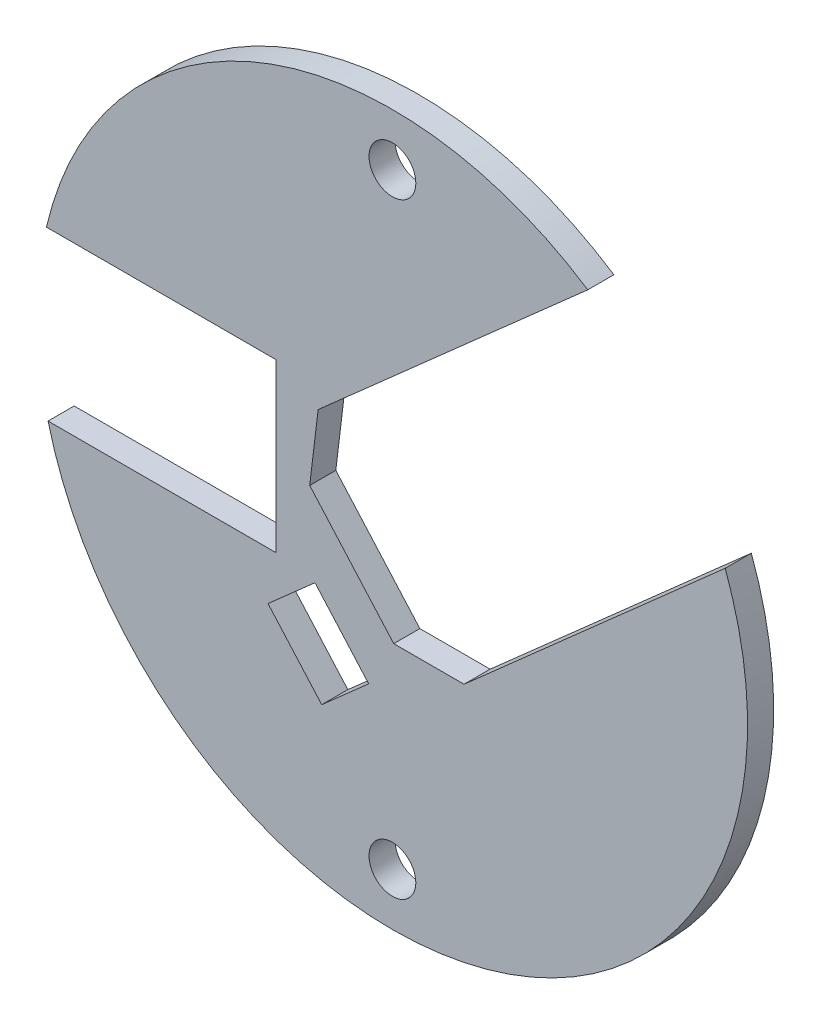
ISO-10303-21;
HEADER;
FILE_DESCRIPTION(('STEP AP214'),'2;1');
FILE_NAME('part.step','',(''),(''),'','','');
FILE_SCHEMA(('AUTOMOTIVE_DESIGN { 1 0 10303 214 1 1 1 1 }'));
ENDSEC;
DATA;
#1=APPLICATION_CONTEXT('core data for automotive mechanical design processes');
#2=APPLICATION_PROTOCOL_DEFINITION('international standard','automotive_design',2000,#1);
#3=PRODUCT_CONTEXT('',#1,'mechanical');
#4=PRODUCT('Part','Part','',(#3));
#5=PRODUCT_RELATED_PRODUCT_CATEGORY('part','',(#4));
#6=PRODUCT_DEFINITION_FORMATION('','',#4);
#7=PRODUCT_DEFINITION_CONTEXT('part definition',#1,'design');
#8=PRODUCT_DEFINITION('design','',#6,#7);
#9=PRODUCT_DEFINITION_SHAPE('','',#8);
#10=(LENGTH_UNIT() NAMED_UNIT(*) SI_UNIT(.MILLI.,.METRE.));
#11=(NAMED_UNIT(*) PLANE_ANGLE_UNIT() SI_UNIT($,.RADIAN.));
#12=(NAMED_UNIT(*) SI_UNIT($,.STERADIAN.) SOLID_ANGLE_UNIT());
#13=UNCERTAINTY_MEASURE_WITH_UNIT(LENGTH_MEASURE(1.E-05),#10,'distance_accuracy_value','');
#14=(GEOMETRIC_REPRESENTATION_CONTEXT(3) GLOBAL_UNCERTAINTY_ASSIGNED_CONTEXT((#13)) GLOBAL_UNIT_ASSIGNED_CONTEXT((#10,
#11,#12)) REPRESENTATION_CONTEXT('',''));
#15=CARTESIAN_POINT('',(0.,0.,0.));
#16=DIRECTION('',(0.,0.,1.));
#17=DIRECTION('',(1.,0.,0.));
#18=AXIS2_PLACEMENT_3D('',#15,#16,#17);
#19=CARTESIAN_POINT('',(-3.73426164317338,4.22147900554515,1.5875));
#20=DIRECTION('',(-0.66256157635468,0.749007448252954,0.));
#21=DIRECTION('',(-0.749007448252954,-0.66256157635468,0.));
#22=AXIS2_PLACEMENT_3D('',#19,#20,#21);
#23=PLANE('',#22);
#24=DIRECTION('',(0.749007448252954,0.66256157635468,0.));
#25=VECTOR('',#24,1.);
#26=CARTESIAN_POINT('',(-3.73426164317338,4.22147900554515,0.));
#27=LINE('',#26,#25);
#28=CARTESIAN_POINT('',(-4.51528115813224,3.5306,0.));
#29=VERTEX_POINT('',#28);
#30=CARTESIAN_POINT('',(11.8760761518911,18.0301668110554,0.));
#31=VERTEX_POINT('',#30);
#32=EDGE_CURVE('E189',#29,#31,#27,.T.);
#33=ORIENTED_EDGE('',*,*,#32,.T.);
#34=DIRECTION('',(0.,0.,-1.));
#35=VECTOR('',#34,1.);
#36=CARTESIAN_POINT('',(11.8760761518911,18.0301668110554,1.5875));
#37=LINE('',#36,#35);
#38=CARTESIAN_POINT('',(11.8760761518911,18.0301668110554,1.5875));
#39=VERTEX_POINT('',#38);
#40=EDGE_CURVE('E11',#39,#31,#37,.T.);
#41=ORIENTED_EDGE('',*,*,#40,.F.);
#42=DIRECTION('',(0.749007448252954,0.66256157635468,0.));
#43=VECTOR('',#42,1.);
#44=CARTESIAN_POINT('',(-3.73426164317338,4.22147900554515,1.5875));
#45=LINE('',#44,#43);
#46=CARTESIAN_POINT('',(-4.51528115813224,3.5306,1.5875));
#47=VERTEX_POINT('',#46);
#48=EDGE_CURVE('E263',#47,#39,#45,.T.);
#49=ORIENTED_EDGE('',*,*,#48,.F.);
#50=DIRECTION('',(0.,0.,-1.));
#51=VECTOR('',#50,1.);
#52=CARTESIAN_POINT('',(-4.51528115813224,3.5306,1.5875));
#53=LINE('',#52,#51);
#54=EDGE_CURVE('E53',#47,#29,#53,.T.);
#55=ORIENTED_EDGE('',*,*,#54,.T.);
#56=EDGE_LOOP('',(#33,#41,#49,#55));
#57=FACE_BOUND('',#56,.T.);
#58=ADVANCED_FACE('F34',(#57),#23,.F.);
#59=CARTESIAN_POINT('',(0.,0.,1.5875));
#60=DIRECTION('',(0.,0.,-1.));
#61=DIRECTION('',(-1.,0.,0.));
#62=AXIS2_PLACEMENT_3D('',#59,#60,#61);
#63=CYLINDRICAL_SURFACE('',#62,21.59);
#64=CARTESIAN_POINT('',(0.,0.,0.));
#65=DIRECTION('',(0.,0.,1.));
#66=DIRECTION('',(1.,0.,0.));
#67=AXIS2_PLACEMENT_3D('',#64,#65,#66);
#68=CIRCLE('',#67,21.59);
#69=CARTESIAN_POINT('',(-21.0319975694179,4.8768,0.));
#70=VERTEX_POINT('',#69);
#71=EDGE_CURVE('E191',#31,#70,#68,.T.);
#72=ORIENTED_EDGE('',*,*,#71,.T.);
#73=DIRECTION('',(0.,0.,-1.));
#74=VECTOR('',#73,1.);
#75=CARTESIAN_POINT('',(-21.0319975694179,4.8768,1.5875));
#76=LINE('',#75,#74);
#77=CARTESIAN_POINT('',(-21.0319975694179,4.8768,1.5875));
#78=VERTEX_POINT('',#77);
#79=EDGE_CURVE('E44',#78,#70,#76,.T.);
#80=ORIENTED_EDGE('',*,*,#79,.F.);
#81=CARTESIAN_POINT('',(0.,0.,1.5875));
#82=DIRECTION('',(0.,0.,1.));
#83=DIRECTION('',(1.,0.,0.));
#84=AXIS2_PLACEMENT_3D('',#81,#82,#83);
#85=CIRCLE('',#84,21.59);
#86=EDGE_CURVE('E265',#39,#78,#85,.T.);
#87=ORIENTED_EDGE('',*,*,#86,.F.);
#88=ORIENTED_EDGE('',*,*,#40,.T.);
#89=EDGE_LOOP('',(#72,#80,#87,#88));
#90=FACE_BOUND('',#89,.T.);
#91=ADVANCED_FACE('F299',(#90),#63,.T.);
#92=CARTESIAN_POINT('',(0.,4.8768,1.5875));
#93=DIRECTION('',(0.,1.,0.));
#94=DIRECTION('',(-1.,0.,0.));
#95=AXIS2_PLACEMENT_3D('',#92,#93,#94);
#96=PLANE('',#95);
#97=DIRECTION('',(1.,0.,0.));
#98=VECTOR('',#97,1.);
#99=CARTESIAN_POINT('',(0.,4.8768,0.));
#100=LINE('',#99,#98);
#101=CARTESIAN_POINT('',(-7.08496533764944,4.8768,0.));
#102=VERTEX_POINT('',#101);
#103=EDGE_CURVE('E193',#70,#102,#100,.T.);
#104=ORIENTED_EDGE('',*,*,#103,.T.);
#105=DIRECTION('',(0.,0.,-1.));
#106=VECTOR('',#105,1.);
#107=CARTESIAN_POINT('',(-7.08496533764944,4.8768,1.5875));
#108=LINE('',#107,#106);
#109=CARTESIAN_POINT('',(-7.08496533764944,4.8768,1.5875));
#110=VERTEX_POINT('',#109);
#111=EDGE_CURVE('E221',#110,#102,#108,.T.);
#112=ORIENTED_EDGE('',*,*,#111,.F.);
#113=DIRECTION('',(1.,0.,0.));
#114=VECTOR('',#113,1.);
#115=CARTESIAN_POINT('',(0.,4.8768,1.5875));
#116=LINE('',#115,#114);
#117=EDGE_CURVE('E267',#78,#110,#116,.T.);
#118=ORIENTED_EDGE('',*,*,#117,.F.);
#119=ORIENTED_EDGE('',*,*,#79,.T.);
#120=EDGE_LOOP('',(#104,#112,#118,#119));
#121=FACE_BOUND('',#120,.T.);
#122=ADVANCED_FACE('F304',(#121),#96,.F.);
#123=CARTESIAN_POINT('',(-7.08496533764945,0.,1.5875));
#124=DIRECTION('',(1.,0.,0.));
#125=DIRECTION('',(0.,1.,0.));
#126=AXIS2_PLACEMENT_3D('',#123,#124,#125);
#127=PLANE('',#126);
#128=DIRECTION('',(0.,-1.,0.));
#129=VECTOR('',#128,1.);
#130=CARTESIAN_POINT('',(-7.08496533764945,0.,0.));
#131=LINE('',#130,#129);
#132=CARTESIAN_POINT('',(-7.08496533764946,-5.2832,0.));
#133=VERTEX_POINT('',#132);
#134=EDGE_CURVE('E196',#102,#133,#131,.T.);
#135=ORIENTED_EDGE('',*,*,#134,.T.);
#136=DIRECTION('',(0.,0.,-1.));
#137=VECTOR('',#136,1.);
#138=CARTESIAN_POINT('',(-7.08496533764946,-5.2832,1.5875));
#139=LINE('',#138,#137);
#140=CARTESIAN_POINT('',(-7.08496533764946,-5.2832,1.5875));
#141=VERTEX_POINT('',#140);
#142=EDGE_CURVE('E218',#141,#133,#139,.T.);
#143=ORIENTED_EDGE('',*,*,#142,.F.);
#144=DIRECTION('',(0.,-1.,0.));
#145=VECTOR('',#144,1.);
#146=CARTESIAN_POINT('',(-7.08496533764945,0.,1.5875));
#147=LINE('',#146,#145);
#148=EDGE_CURVE('E270',#110,#141,#147,.T.);
#149=ORIENTED_EDGE('',*,*,#148,.F.);
#150=ORIENTED_EDGE('',*,*,#111,.T.);
#151=EDGE_LOOP('',(#135,#143,#149,#150));
#152=FACE_BOUND('',#151,.T.);
#153=ADVANCED_FACE('F335',(#152),#127,.F.);
#154=CARTESIAN_POINT('',(0.,-5.2832,1.5875));
#155=DIRECTION('',(0.,-1.,0.));
#156=DIRECTION('',(1.,0.,0.));
#157=AXIS2_PLACEMENT_3D('',#154,#155,#156);
#158=PLANE('',#157);
#159=DIRECTION('',(-1.,0.,0.));
#160=VECTOR('',#159,1.);
#161=CARTESIAN_POINT('',(0.,-5.2832,0.));
#162=LINE('',#161,#160);
#163=CARTESIAN_POINT('',(-20.9336068980002,-5.2832,0.));
#164=VERTEX_POINT('',#163);
#165=EDGE_CURVE('E198',#133,#164,#162,.T.);
#166=ORIENTED_EDGE('',*,*,#165,.T.);
#167=DIRECTION('',(0.,0.,-1.));
#168=VECTOR('',#167,1.);
#169=CARTESIAN_POINT('',(-20.9336068980002,-5.2832,1.5875));
#170=LINE('',#169,#168);
#171=CARTESIAN_POINT('',(-20.9336068980002,-5.2832,1.5875));
#172=VERTEX_POINT('',#171);
#173=EDGE_CURVE('E215',#172,#164,#170,.T.);
#174=ORIENTED_EDGE('',*,*,#173,.F.);
#175=DIRECTION('',(-1.,0.,0.));
#176=VECTOR('',#175,1.);
#177=CARTESIAN_POINT('',(0.,-5.2832,1.5875));
#178=LINE('',#177,#176);
#179=EDGE_CURVE('E272',#141,#172,#178,.T.);
#180=ORIENTED_EDGE('',*,*,#179,.F.);
#181=ORIENTED_EDGE('',*,*,#142,.T.);
#182=EDGE_LOOP('',(#166,#174,#180,#181));
#183=FACE_BOUND('',#182,.T.);
#184=ADVANCED_FACE('F333',(#183),#158,.F.);
#185=CARTESIAN_POINT('',(20.2280419112054,7.54681525138367,0.));
#186=VERTEX_POINT('',#185);
#187=EDGE_CURVE('E194',#164,#186,#68,.T.);
#188=ORIENTED_EDGE('',*,*,#187,.T.);
#189=DIRECTION('',(0.,0.,-1.));
#190=VECTOR('',#189,1.);
#191=CARTESIAN_POINT('',(20.2280419112054,7.54681525138367,1.5875));
#192=LINE('',#191,#190);
#193=CARTESIAN_POINT('',(20.2280419112054,7.54681525138367,1.5875));
#194=VERTEX_POINT('',#193);
#195=EDGE_CURVE('E213',#194,#186,#192,.T.);
#196=ORIENTED_EDGE('',*,*,#195,.F.);
#197=EDGE_CURVE('E268',#172,#194,#85,.T.);
#198=ORIENTED_EDGE('',*,*,#197,.F.);
#199=ORIENTED_EDGE('',*,*,#173,.T.);
#200=EDGE_LOOP('',(#188,#196,#198,#199));
#201=FACE_BOUND('',#200,.T.);
#202=ADVANCED_FACE('F280',(#201),#63,.T.);
#203=CARTESIAN_POINT('',(5.13465510559509,-5.80458489527924,1.5875));
#204=DIRECTION('',(-0.66256157635468,0.749007448252954,0.));
#205=DIRECTION('',(-0.749007448252954,-0.66256157635468,0.));
#206=AXIS2_PLACEMENT_3D('',#203,#204,#205);
#207=PLANE('',#206);
#208=DIRECTION('',(0.749007448252954,0.66256157635468,0.));
#209=VECTOR('',#208,1.);
#210=CARTESIAN_POINT('',(5.13465510559509,-5.80458489527924,0.));
#211=LINE('',#210,#209);
#212=CARTESIAN_POINT('',(4.35363559063623,-6.49546390082439,0.));
#213=VERTEX_POINT('',#212);
#214=EDGE_CURVE('E200',#213,#186,#211,.T.);
#215=ORIENTED_EDGE('',*,*,#214,.F.);
#216=DIRECTION('',(0.,0.,-1.));
#217=VECTOR('',#216,1.);
#218=CARTESIAN_POINT('',(4.35363559063623,-6.49546390082439,1.5875));
#219=LINE('',#218,#217);
#220=CARTESIAN_POINT('',(4.35363559063623,-6.49546390082439,1.5875));
#221=VERTEX_POINT('',#220);
#222=EDGE_CURVE('E163',#221,#213,#219,.T.);
#223=ORIENTED_EDGE('',*,*,#222,.F.);
#224=DIRECTION('',(0.749007448252954,0.66256157635468,0.));
#225=VECTOR('',#224,1.);
#226=CARTESIAN_POINT('',(5.13465510559509,-5.80458489527924,1.5875));
#227=LINE('',#226,#225);
#228=EDGE_CURVE('E153',#221,#194,#227,.T.);
#229=ORIENTED_EDGE('',*,*,#228,.T.);
#230=ORIENTED_EDGE('',*,*,#195,.T.);
#231=EDGE_LOOP('',(#215,#223,#229,#230));
#232=FACE_BOUND('',#231,.T.);
#233=ADVANCED_FACE('F283',(#232),#207,.T.);
#234=CARTESIAN_POINT('',(0.,-6.49546390082439,1.5875));
#235=DIRECTION('',(0.,-1.,0.));
#236=DIRECTION('',(0.,0.,-1.));
#237=AXIS2_PLACEMENT_3D('',#234,#235,#236);
#238=PLANE('',#237);
#239=DIRECTION('',(-1.,0.,0.));
#240=VECTOR('',#239,1.);
#241=CARTESIAN_POINT('',(0.,-6.49546390082439,0.));
#242=LINE('',#241,#240);
#243=CARTESIAN_POINT('',(0.0807525172120513,-6.49546390082439,0.));
#244=VERTEX_POINT('',#243);
#245=EDGE_CURVE('E160',#213,#244,#242,.T.);
#246=ORIENTED_EDGE('',*,*,#245,.T.);
#247=DIRECTION('',(0.,0.,-1.));
#248=VECTOR('',#247,1.);
#249=CARTESIAN_POINT('',(0.0807525172120513,-6.49546390082439,1.5875));
#250=LINE('',#249,#248);
#251=CARTESIAN_POINT('',(0.0807525172120513,-6.49546390082439,1.5875));
#252=VERTEX_POINT('',#251);
#253=EDGE_CURVE('E157',#252,#244,#250,.T.);
#254=ORIENTED_EDGE('',*,*,#253,.F.);
#255=DIRECTION('',(-1.,0.,0.));
#256=VECTOR('',#255,1.);
#257=CARTESIAN_POINT('',(0.,-6.49546390082439,1.5875));
#258=LINE('',#257,#256);
#259=EDGE_CURVE('E145',#221,#252,#258,.T.);
#260=ORIENTED_EDGE('',*,*,#259,.F.);
#261=ORIENTED_EDGE('',*,*,#222,.T.);
#262=EDGE_LOOP('',(#246,#254,#260,#261));
#263=FACE_BOUND('',#262,.T.);
#264=ADVANCED_FACE('F158',(#263),#238,.F.);
#265=CARTESIAN_POINT('',(-3.17815886688987,-2.81135515229351,1.5875));
#266=DIRECTION('',(0.749007448252954,0.66256157635468,0.));
#267=DIRECTION('',(-0.66256157635468,0.749007448252954,0.));
#268=AXIS2_PLACEMENT_3D('',#265,#266,#267);
#269=PLANE('',#268);
#270=DIRECTION('',(0.66256157635468,-0.749007448252954,0.));
#271=VECTOR('',#270,1.);
#272=CARTESIAN_POINT('',(-3.17815886688987,-2.81135515229351,0.));
#273=LINE('',#272,#271);
#274=CARTESIAN_POINT('',(-5.02756533764946,-0.720652535538369,0.));
#275=VERTEX_POINT('',#274);
#276=EDGE_CURVE('E204',#275,#244,#273,.T.);
#277=ORIENTED_EDGE('',*,*,#276,.F.);
#278=DIRECTION('',(0.,0.,-1.));
#279=VECTOR('',#278,1.);
#280=CARTESIAN_POINT('',(-5.02756533764946,-0.720652535538369,1.5875));
#281=LINE('',#280,#279);
#282=CARTESIAN_POINT('',(-5.02756533764946,-0.720652535538369,1.5875));
#283=VERTEX_POINT('',#282);
#284=EDGE_CURVE('E97',#283,#275,#281,.T.);
#285=ORIENTED_EDGE('',*,*,#284,.F.);
#286=DIRECTION('',(0.66256157635468,-0.749007448252954,0.));
#287=VECTOR('',#286,1.);
#288=CARTESIAN_POINT('',(-3.17815886688987,-2.81135515229351,1.5875));
#289=LINE('',#288,#287);
#290=EDGE_CURVE('E151',#283,#252,#289,.T.);
#291=ORIENTED_EDGE('',*,*,#290,.T.);
#292=ORIENTED_EDGE('',*,*,#253,.T.);
#293=EDGE_LOOP('',(#277,#285,#291,#292));
#294=FACE_BOUND('',#293,.T.);
#295=ADVANCED_FACE('F165',(#294),#269,.T.);
#296=CARTESIAN_POINT('',(-5.46113356916488,-4.83084283702258,1.5875));
#297=DIRECTION('',(0.749007448252954,0.66256157635468,0.));
#298=DIRECTION('',(-0.66256157635468,0.749007448252954,0.));
#299=AXIS2_PLACEMENT_3D('',#296,#297,#298);
#300=PLANE('',#299);
#301=DIRECTION('',(0.66256157635468,-0.749007448252954,0.));
#302=VECTOR('',#301,1.);
#303=CARTESIAN_POINT('',(-5.46113356916488,-4.83084283702258,0.));
#304=LINE('',#303,#302);
#305=CARTESIAN_POINT('',(-4.70834541938866,-5.68184891896463,0.));
#306=VERTEX_POINT('',#305);
#307=CARTESIAN_POINT('',(-1.44350699574333,-9.37265802097589,0.));
#308=VERTEX_POINT('',#307);
#309=EDGE_CURVE('E172',#306,#308,#304,.T.);
#310=ORIENTED_EDGE('',*,*,#309,.T.);
#311=DIRECTION('',(0.,0.,-1.));
#312=VECTOR('',#311,1.);
#313=CARTESIAN_POINT('',(-1.44350699574333,-9.37265802097589,1.5875));
#314=LINE('',#313,#312);
#315=CARTESIAN_POINT('',(-1.44350699574333,-9.37265802097589,1.5875));
#316=VERTEX_POINT('',#315);
#317=EDGE_CURVE('E38',#316,#308,#314,.T.);
#318=ORIENTED_EDGE('',*,*,#317,.F.);
#319=DIRECTION('',(0.66256157635468,-0.749007448252954,0.));
#320=VECTOR('',#319,1.);
#321=CARTESIAN_POINT('',(-5.46113356916488,-4.83084283702258,1.5875));
#322=LINE('',#321,#320);
#323=CARTESIAN_POINT('',(-4.70834541938866,-5.68184891896463,1.5875));
#324=VERTEX_POINT('',#323);
#325=EDGE_CURVE('E209',#324,#316,#322,.T.);
#326=ORIENTED_EDGE('',*,*,#325,.F.);
#327=DIRECTION('',(0.,0.,-1.));
#328=VECTOR('',#327,1.);
#329=CARTESIAN_POINT('',(-4.70834541938866,-5.68184891896463,1.5875));
#330=LINE('',#329,#328);
#331=EDGE_CURVE('E168',#324,#306,#330,.T.);
#332=ORIENTED_EDGE('',*,*,#331,.T.);
#333=EDGE_LOOP('',(#310,#318,#326,#332));
#334=FACE_BOUND('',#333,.T.);
#335=ADVANCED_FACE('F36',(#334),#300,.F.);
#336=CARTESIAN_POINT('',(4.01762657342154,-4.54181518395331,1.5875));
#337=DIRECTION('',(0.66256157635468,-0.749007448252954,0.));
#338=DIRECTION('',(0.749007448252954,0.66256157635468,0.));
#339=AXIS2_PLACEMENT_3D('',#336,#337,#338);
#340=PLANE('',#339);
#341=DIRECTION('',(-0.749007448252954,-0.66256157635468,0.));
#342=VECTOR('',#341,1.);
#343=CARTESIAN_POINT('',(4.01762657342154,-4.54181518395331,0.));
#344=LINE('',#343,#342);
#345=CARTESIAN_POINT('',(-4.29722537358709,-11.8970176268872,0.));
#346=VERTEX_POINT('',#345);
#347=EDGE_CURVE('E175',#308,#346,#344,.T.);
#348=ORIENTED_EDGE('',*,*,#347,.T.);
#349=DIRECTION('',(0.,0.,-1.));
#350=VECTOR('',#349,1.);
#351=CARTESIAN_POINT('',(-4.29722537358709,-11.8970176268872,1.5875));
#352=LINE('',#351,#350);
#353=CARTESIAN_POINT('',(-4.29722537358709,-11.8970176268872,1.5875));
#354=VERTEX_POINT('',#353);
#355=EDGE_CURVE('E229',#354,#346,#352,.T.);
#356=ORIENTED_EDGE('',*,*,#355,.F.);
#357=DIRECTION('',(-0.749007448252954,-0.66256157635468,0.));
#358=VECTOR('',#357,1.);
#359=CARTESIAN_POINT('',(4.01762657342154,-4.54181518395331,1.5875));
#360=LINE('',#359,#358);
#361=EDGE_CURVE('E110',#316,#354,#360,.T.);
#362=ORIENTED_EDGE('',*,*,#361,.F.);
#363=ORIENTED_EDGE('',*,*,#317,.T.);
#364=EDGE_LOOP('',(#348,#356,#362,#363));
#365=FACE_BOUND('',#364,.T.);
#366=ADVANCED_FACE('F234',(#365),#340,.F.);
#367=CARTESIAN_POINT('',(-8.31485194700863,-7.35520244293391,1.5875));
#368=DIRECTION('',(0.749007448252954,0.66256157635468,0.));
#369=DIRECTION('',(-0.66256157635468,0.749007448252954,0.));
#370=AXIS2_PLACEMENT_3D('',#367,#368,#369);
#371=PLANE('',#370);
#372=DIRECTION('',(0.66256157635468,-0.749007448252954,0.));
#373=VECTOR('',#372,1.);
#374=CARTESIAN_POINT('',(-8.31485194700863,-7.35520244293391,0.));
#375=LINE('',#374,#373);
#376=CARTESIAN_POINT('',(-7.56206379723241,-8.20620852487597,0.));
#377=VERTEX_POINT('',#376);
#378=EDGE_CURVE('E178',#377,#346,#375,.T.);
#379=ORIENTED_EDGE('',*,*,#378,.F.);
#380=DIRECTION('',(0.,0.,-1.));
#381=VECTOR('',#380,1.);
#382=CARTESIAN_POINT('',(-7.56206379723241,-8.20620852487597,1.5875));
#383=LINE('',#382,#381);
#384=CARTESIAN_POINT('',(-7.56206379723241,-8.20620852487597,1.5875));
#385=VERTEX_POINT('',#384);
#386=EDGE_CURVE('E228',#385,#377,#383,.T.);
#387=ORIENTED_EDGE('',*,*,#386,.F.);
#388=DIRECTION('',(0.66256157635468,-0.749007448252954,0.));
#389=VECTOR('',#388,1.);
#390=CARTESIAN_POINT('',(-8.31485194700863,-7.35520244293391,1.5875));
#391=LINE('',#390,#389);
#392=EDGE_CURVE('E246',#385,#354,#391,.T.);
#393=ORIENTED_EDGE('',*,*,#392,.T.);
#394=ORIENTED_EDGE('',*,*,#355,.T.);
#395=EDGE_LOOP('',(#379,#387,#393,#394));
#396=FACE_BOUND('',#395,.T.);
#397=ADVANCED_FACE('F243',(#396),#371,.T.);
#398=CARTESIAN_POINT('',(0.,-18.415,1.5875));
#399=DIRECTION('',(0.,0.,-1.));
#400=DIRECTION('',(-1.,0.,0.));
#401=AXIS2_PLACEMENT_3D('',#398,#399,#400);
#402=CYLINDRICAL_SURFACE('',#401,1.4224);
#403=CARTESIAN_POINT('',(0.,-18.415,1.5875));
#404=DIRECTION('',(0.,0.,1.));
#405=DIRECTION('',(1.,0.,0.));
#406=AXIS2_PLACEMENT_3D('',#403,#404,#405);
#407=CIRCLE('',#406,1.4224);
#408=CARTESIAN_POINT('',(1.4224,-18.415,1.5875));
#409=VERTEX_POINT('',#408);
#410=EDGE_CURVE('E260',#409,#409,#407,.T.);
#411=ORIENTED_EDGE('',*,*,#410,.T.);
#412=EDGE_LOOP('',(#411));
#413=FACE_BOUND('',#412,.T.);
#414=CARTESIAN_POINT('',(0.,-18.415,0.));
#415=DIRECTION('',(0.,0.,1.));
#416=DIRECTION('',(1.,0.,0.));
#417=AXIS2_PLACEMENT_3D('',#414,#415,#416);
#418=CIRCLE('',#417,1.4224);
#419=CARTESIAN_POINT('',(1.4224,-18.415,0.));
#420=VERTEX_POINT('',#419);
#421=EDGE_CURVE('E186',#420,#420,#418,.T.);
#422=ORIENTED_EDGE('',*,*,#421,.F.);
#423=EDGE_LOOP('',(#422));
#424=FACE_BOUND('',#423,.T.);
#425=ADVANCED_FACE('F310',(#413,#424),#402,.F.);
#426=CARTESIAN_POINT('',(0.,18.415,1.5875));
#427=DIRECTION('',(0.,0.,-1.));
#428=DIRECTION('',(-1.,0.,0.));
#429=AXIS2_PLACEMENT_3D('',#426,#427,#428);
#430=CYLINDRICAL_SURFACE('',#429,1.4224);
#431=CARTESIAN_POINT('',(0.,18.415,1.5875));
#432=DIRECTION('',(0.,0.,1.));
#433=DIRECTION('',(1.,0.,0.));
#434=AXIS2_PLACEMENT_3D('',#431,#432,#433);
#435=CIRCLE('',#434,1.4224);
#436=CARTESIAN_POINT('',(1.4224,18.415,1.5875));
#437=VERTEX_POINT('',#436);
#438=EDGE_CURVE('E251',#437,#437,#435,.T.);
#439=ORIENTED_EDGE('',*,*,#438,.T.);
#440=EDGE_LOOP('',(#439));
#441=FACE_BOUND('',#440,.T.);
#442=CARTESIAN_POINT('',(0.,18.415,0.));
#443=DIRECTION('',(0.,0.,1.));
#444=DIRECTION('',(1.,0.,0.));
#445=AXIS2_PLACEMENT_3D('',#442,#443,#444);
#446=CIRCLE('',#445,1.4224);
#447=CARTESIAN_POINT('',(1.4224,18.415,0.));
#448=VERTEX_POINT('',#447);
#449=EDGE_CURVE('E183',#448,#448,#446,.T.);
#450=ORIENTED_EDGE('',*,*,#449,.F.);
#451=EDGE_LOOP('',(#450));
#452=FACE_BOUND('',#451,.T.);
#453=ADVANCED_FACE('F294',(#441,#452),#430,.F.);
#454=CARTESIAN_POINT('',(0.752788149776217,-0.851006081942052,1.5875));
#455=DIRECTION('',(-0.66256157635468,0.749007448252954,0.));
#456=DIRECTION('',(-0.749007448252954,-0.66256157635468,0.));
#457=AXIS2_PLACEMENT_3D('',#454,#455,#456);
#458=PLANE('',#457);
#459=DIRECTION('',(0.749007448252954,0.66256157635468,0.));
#460=VECTOR('',#459,1.);
#461=CARTESIAN_POINT('',(0.752788149776217,-0.851006081942052,0.));
#462=LINE('',#461,#460);
#463=EDGE_CURVE('E181',#377,#306,#462,.T.);
#464=ORIENTED_EDGE('',*,*,#463,.T.);
#465=ORIENTED_EDGE('',*,*,#331,.F.);
#466=DIRECTION('',(0.749007448252954,0.66256157635468,0.));
#467=VECTOR('',#466,1.);
#468=CARTESIAN_POINT('',(0.752788149776217,-0.851006081942052,1.5875));
#469=LINE('',#468,#467);
#470=EDGE_CURVE('E248',#385,#324,#469,.T.);
#471=ORIENTED_EDGE('',*,*,#470,.F.);
#472=ORIENTED_EDGE('',*,*,#386,.T.);
#473=EDGE_LOOP('',(#464,#465,#471,#472));
#474=FACE_BOUND('',#473,.T.);
#475=ADVANCED_FACE('F249',(#474),#458,.F.);
#476=CARTESIAN_POINT('',(-4.87000927917982,0.586845567740416,1.5875));
#477=DIRECTION('',(0.992817765614227,-0.119636467186111,0.));
#478=DIRECTION('',(0.119636467186111,0.992817765614227,0.));
#479=AXIS2_PLACEMENT_3D('',#476,#477,#478);
#480=PLANE('',#479);
#481=DIRECTION('',(-0.119636467186111,-0.992817765614227,0.));
#482=VECTOR('',#481,1.);
#483=CARTESIAN_POINT('',(-4.87000927917982,0.586845567740416,0.));
#484=LINE('',#483,#482);
#485=EDGE_CURVE('E206',#29,#275,#484,.T.);
#486=ORIENTED_EDGE('',*,*,#485,.F.);
#487=ORIENTED_EDGE('',*,*,#54,.F.);
#488=DIRECTION('',(-0.119636467186111,-0.992817765614227,0.));
#489=VECTOR('',#488,1.);
#490=CARTESIAN_POINT('',(-4.87000927917982,0.586845567740416,1.5875));
#491=LINE('',#490,#489);
#492=EDGE_CURVE('E166',#47,#283,#491,.T.);
#493=ORIENTED_EDGE('',*,*,#492,.T.);
#494=ORIENTED_EDGE('',*,*,#284,.T.);
#495=EDGE_LOOP('',(#486,#487,#493,#494));
#496=FACE_BOUND('',#495,.T.);
#497=ADVANCED_FACE('F286',(#496),#480,.T.);
#498=CARTESIAN_POINT('',(0.,0.,1.5875));
#499=DIRECTION('',(0.,0.,1.));
#500=DIRECTION('',(1.,0.,0.));
#501=AXIS2_PLACEMENT_3D('',#498,#499,#500);
#502=PLANE('',#501);
#503=ORIENTED_EDGE('',*,*,#325,.T.);
#504=ORIENTED_EDGE('',*,*,#361,.T.);
#505=ORIENTED_EDGE('',*,*,#392,.F.);
#506=ORIENTED_EDGE('',*,*,#470,.T.);
#507=EDGE_LOOP('',(#503,#504,#505,#506));
#508=FACE_BOUND('',#507,.T.);
#509=ORIENTED_EDGE('',*,*,#438,.F.);
#510=EDGE_LOOP('',(#509));
#511=FACE_BOUND('',#510,.T.);
#512=ORIENTED_EDGE('',*,*,#410,.F.);
#513=EDGE_LOOP('',(#512));
#514=FACE_BOUND('',#513,.T.);
#515=ORIENTED_EDGE('',*,*,#48,.T.);
#516=ORIENTED_EDGE('',*,*,#86,.T.);
#517=ORIENTED_EDGE('',*,*,#117,.T.);
#518=ORIENTED_EDGE('',*,*,#148,.T.);
#519=ORIENTED_EDGE('',*,*,#179,.T.);
#520=ORIENTED_EDGE('',*,*,#197,.T.);
#521=ORIENTED_EDGE('',*,*,#228,.F.);
#522=ORIENTED_EDGE('',*,*,#259,.T.);
#523=ORIENTED_EDGE('',*,*,#290,.F.);
#524=ORIENTED_EDGE('',*,*,#492,.F.);
#525=EDGE_LOOP('',(#515,#516,#517,#518,#519,#520,#521,#522,#523,#524));
#526=FACE_BOUND('',#525,.T.);
#527=ADVANCED_FACE('F148',(#508,#511,#514,#526),#502,.T.);
#528=CARTESIAN_POINT('',(0.,0.,0.));
#529=DIRECTION('',(0.,0.,1.));
#530=DIRECTION('',(1.,0.,0.));
#531=AXIS2_PLACEMENT_3D('',#528,#529,#530);
#532=PLANE('',#531);
#533=ORIENTED_EDGE('',*,*,#309,.F.);
#534=ORIENTED_EDGE('',*,*,#463,.F.);
#535=ORIENTED_EDGE('',*,*,#378,.T.);
#536=ORIENTED_EDGE('',*,*,#347,.F.);
#537=EDGE_LOOP('',(#533,#534,#535,#536));
#538=FACE_BOUND('',#537,.T.);
#539=ORIENTED_EDGE('',*,*,#449,.T.);
#540=EDGE_LOOP('',(#539));
#541=FACE_BOUND('',#540,.T.);
#542=ORIENTED_EDGE('',*,*,#421,.T.);
#543=EDGE_LOOP('',(#542));
#544=FACE_BOUND('',#543,.T.);
#545=ORIENTED_EDGE('',*,*,#32,.F.);
#546=ORIENTED_EDGE('',*,*,#485,.T.);
#547=ORIENTED_EDGE('',*,*,#276,.T.);
#548=ORIENTED_EDGE('',*,*,#245,.F.);
#549=ORIENTED_EDGE('',*,*,#214,.T.);
#550=ORIENTED_EDGE('',*,*,#187,.F.);
#551=ORIENTED_EDGE('',*,*,#165,.F.);
#552=ORIENTED_EDGE('',*,*,#134,.F.);
#553=ORIENTED_EDGE('',*,*,#103,.F.);
#554=ORIENTED_EDGE('',*,*,#71,.F.);
#555=EDGE_LOOP('',(#545,#546,#547,#548,#549,#550,#551,#552,#553,#554));
#556=FACE_BOUND('',#555,.T.);
#557=ADVANCED_FACE('F241',(#538,#541,#544,#556),#532,.F.);
#558=CLOSED_SHELL('',(#58,#91,#122,#153,#184,#202,#233,#264,#295,#335,#366,#397,#425,#453,#475,
#497,#527,#557));
#559=MANIFOLD_SOLID_BREP('B2',#558);
#560=ADVANCED_BREP_SHAPE_REPRESENTATION('',(#18,#559),#14);
#561=SHAPE_DEFINITION_REPRESENTATION(#9,#560);
ENDSEC;
END-ISO-10303-21;
